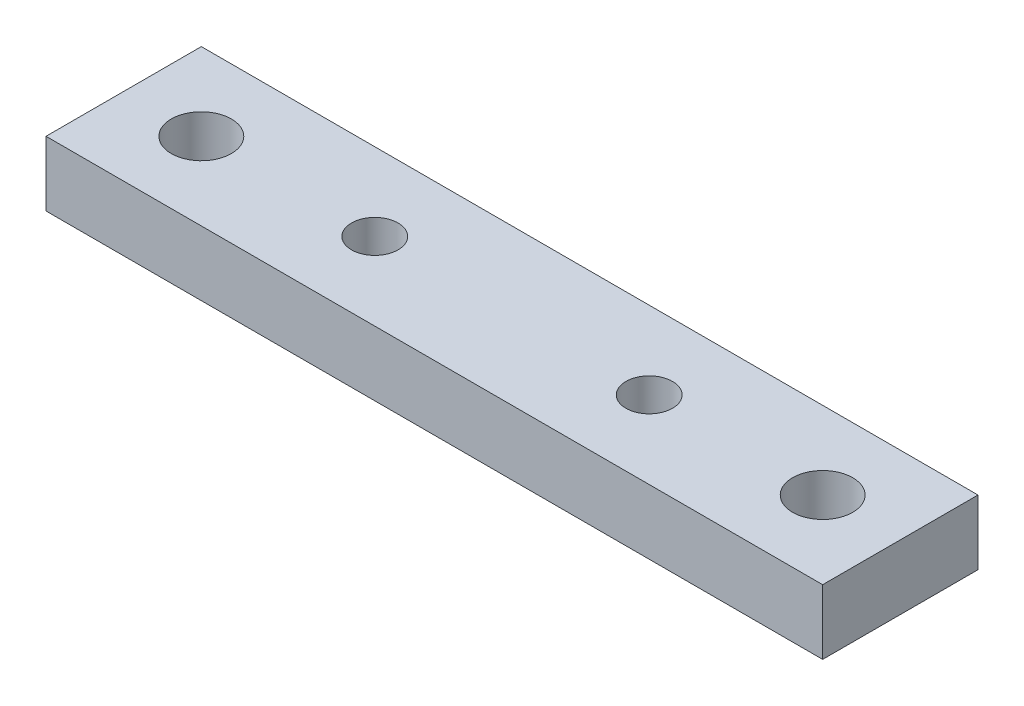
ISO-10303-21;
HEADER;
FILE_DESCRIPTION(('STEP AP214'),'2;1');
FILE_NAME('part.step','',(''),(''),'','','');
FILE_SCHEMA(('AUTOMOTIVE_DESIGN { 1 0 10303 214 1 1 1 1 }'));
ENDSEC;
DATA;
#1=APPLICATION_CONTEXT('core data for automotive mechanical design processes');
#2=APPLICATION_PROTOCOL_DEFINITION('international standard','automotive_design',2000,#1);
#3=PRODUCT_CONTEXT('',#1,'mechanical');
#4=PRODUCT('Part','Part','',(#3));
#5=PRODUCT_RELATED_PRODUCT_CATEGORY('part','',(#4));
#6=PRODUCT_DEFINITION_FORMATION('','',#4);
#7=PRODUCT_DEFINITION_CONTEXT('part definition',#1,'design');
#8=PRODUCT_DEFINITION('design','',#6,#7);
#9=PRODUCT_DEFINITION_SHAPE('','',#8);
#10=(LENGTH_UNIT() NAMED_UNIT(*) SI_UNIT(.MILLI.,.METRE.));
#11=(NAMED_UNIT(*) PLANE_ANGLE_UNIT() SI_UNIT($,.RADIAN.));
#12=(NAMED_UNIT(*) SI_UNIT($,.STERADIAN.) SOLID_ANGLE_UNIT());
#13=UNCERTAINTY_MEASURE_WITH_UNIT(LENGTH_MEASURE(1.E-05),#10,'distance_accuracy_value','');
#14=(GEOMETRIC_REPRESENTATION_CONTEXT(3) GLOBAL_UNCERTAINTY_ASSIGNED_CONTEXT((#13)) GLOBAL_UNIT_ASSIGNED_CONTEXT((#10,
#11,#12)) REPRESENTATION_CONTEXT('',''));
#15=CARTESIAN_POINT('',(0.,0.,0.));
#16=DIRECTION('',(0.,0.,1.));
#17=DIRECTION('',(1.,0.,0.));
#18=AXIS2_PLACEMENT_3D('',#15,#16,#17);
#19=CARTESIAN_POINT('',(19.05,3.175,3.81));
#20=DIRECTION('',(0.,1.,0.));
#21=DIRECTION('',(0.,0.,1.));
#22=AXIS2_PLACEMENT_3D('',#19,#20,#21);
#23=PLANE('',#22);
#24=CARTESIAN_POINT('',(15.24,3.175,0.));
#25=DIRECTION('',(0.,1.,0.));
#26=DIRECTION('',(0.,0.,-1.));
#27=AXIS2_PLACEMENT_3D('',#24,#25,#26);
#28=CIRCLE('',#27,1.4732);
#29=CARTESIAN_POINT('',(15.24,3.175,-1.4732));
#30=VERTEX_POINT('',#29);
#31=EDGE_CURVE('E150',#30,#30,#28,.T.);
#32=ORIENTED_EDGE('',*,*,#31,.F.);
#33=EDGE_LOOP('',(#32));
#34=FACE_BOUND('',#33,.T.);
#35=CARTESIAN_POINT('',(-15.24,3.175,0.));
#36=DIRECTION('',(0.,1.,0.));
#37=DIRECTION('',(0.,0.,1.));
#38=AXIS2_PLACEMENT_3D('',#35,#36,#37);
#39=CIRCLE('',#38,1.4732);
#40=CARTESIAN_POINT('',(-15.24,3.175,1.4732));
#41=VERTEX_POINT('',#40);
#42=EDGE_CURVE('E122',#41,#41,#39,.T.);
#43=ORIENTED_EDGE('',*,*,#42,.F.);
#44=EDGE_LOOP('',(#43));
#45=FACE_BOUND('',#44,.T.);
#46=DIRECTION('',(0.,0.,-1.));
#47=VECTOR('',#46,1.);
#48=CARTESIAN_POINT('',(19.05,3.175,-3.81));
#49=LINE('',#48,#47);
#50=CARTESIAN_POINT('',(19.05,3.175,3.81));
#51=VERTEX_POINT('',#50);
#52=CARTESIAN_POINT('',(19.05,3.175,-3.81));
#53=VERTEX_POINT('',#52);
#54=EDGE_CURVE('E100',#51,#53,#49,.T.);
#55=ORIENTED_EDGE('',*,*,#54,.T.);
#56=DIRECTION('',(-1.,0.,0.));
#57=VECTOR('',#56,1.);
#58=CARTESIAN_POINT('',(-19.05,3.175,-3.81));
#59=LINE('',#58,#57);
#60=CARTESIAN_POINT('',(-19.05,3.175,-3.81));
#61=VERTEX_POINT('',#60);
#62=EDGE_CURVE('E95',#53,#61,#59,.T.);
#63=ORIENTED_EDGE('',*,*,#62,.T.);
#64=DIRECTION('',(0.,0.,1.));
#65=VECTOR('',#64,1.);
#66=CARTESIAN_POINT('',(-19.05,3.175,-3.81));
#67=LINE('',#66,#65);
#68=CARTESIAN_POINT('',(-19.05,3.175,3.81));
#69=VERTEX_POINT('',#68);
#70=EDGE_CURVE('E98',#61,#69,#67,.T.);
#71=ORIENTED_EDGE('',*,*,#70,.T.);
#72=DIRECTION('',(1.,0.,0.));
#73=VECTOR('',#72,1.);
#74=CARTESIAN_POINT('',(-19.05,3.175,3.81));
#75=LINE('',#74,#73);
#76=EDGE_CURVE('E60',#69,#51,#75,.T.);
#77=ORIENTED_EDGE('',*,*,#76,.T.);
#78=EDGE_LOOP('',(#55,#63,#71,#77));
#79=FACE_BOUND('',#78,.T.);
#80=CARTESIAN_POINT('',(-6.731,3.175,0.));
#81=DIRECTION('',(0.,1.,0.));
#82=DIRECTION('',(0.,0.,1.));
#83=AXIS2_PLACEMENT_3D('',#80,#81,#82);
#84=CIRCLE('',#83,1.143);
#85=CARTESIAN_POINT('',(-6.731,3.175,1.143));
#86=VERTEX_POINT('',#85);
#87=EDGE_CURVE('E142',#86,#86,#84,.T.);
#88=ORIENTED_EDGE('',*,*,#87,.F.);
#89=EDGE_LOOP('',(#88));
#90=FACE_BOUND('',#89,.T.);
#91=CARTESIAN_POINT('',(6.731,3.175,0.));
#92=DIRECTION('',(0.,1.,0.));
#93=DIRECTION('',(0.,0.,-1.));
#94=AXIS2_PLACEMENT_3D('',#91,#92,#93);
#95=CIRCLE('',#94,1.143);
#96=CARTESIAN_POINT('',(6.731,3.175,-1.143));
#97=VERTEX_POINT('',#96);
#98=EDGE_CURVE('E158',#97,#97,#95,.T.);
#99=ORIENTED_EDGE('',*,*,#98,.F.);
#100=EDGE_LOOP('',(#99));
#101=FACE_BOUND('',#100,.T.);
#102=ADVANCED_FACE('F39',(#34,#45,#79,#90,#101),#23,.T.);
#103=CARTESIAN_POINT('',(19.05,0.,3.81));
#104=DIRECTION('',(0.,1.,0.));
#105=DIRECTION('',(0.,0.,1.));
#106=AXIS2_PLACEMENT_3D('',#103,#104,#105);
#107=PLANE('',#106);
#108=CARTESIAN_POINT('',(15.24,0.,0.));
#109=DIRECTION('',(0.,1.,0.));
#110=DIRECTION('',(0.,0.,-1.));
#111=AXIS2_PLACEMENT_3D('',#108,#109,#110);
#112=CIRCLE('',#111,1.4732);
#113=CARTESIAN_POINT('',(15.24,0.,-1.4732));
#114=VERTEX_POINT('',#113);
#115=EDGE_CURVE('E154',#114,#114,#112,.T.);
#116=ORIENTED_EDGE('',*,*,#115,.T.);
#117=EDGE_LOOP('',(#116));
#118=FACE_BOUND('',#117,.T.);
#119=CARTESIAN_POINT('',(-15.24,0.,0.));
#120=DIRECTION('',(0.,1.,0.));
#121=DIRECTION('',(0.,0.,1.));
#122=AXIS2_PLACEMENT_3D('',#119,#120,#121);
#123=CIRCLE('',#122,1.4732);
#124=CARTESIAN_POINT('',(-15.24,0.,1.4732));
#125=VERTEX_POINT('',#124);
#126=EDGE_CURVE('E139',#125,#125,#123,.T.);
#127=ORIENTED_EDGE('',*,*,#126,.T.);
#128=EDGE_LOOP('',(#127));
#129=FACE_BOUND('',#128,.T.);
#130=DIRECTION('',(0.,0.,-1.));
#131=VECTOR('',#130,1.);
#132=CARTESIAN_POINT('',(19.05,0.,-3.81));
#133=LINE('',#132,#131);
#134=CARTESIAN_POINT('',(19.05,0.,3.81));
#135=VERTEX_POINT('',#134);
#136=CARTESIAN_POINT('',(19.05,0.,-3.81));
#137=VERTEX_POINT('',#136);
#138=EDGE_CURVE('E118',#135,#137,#133,.T.);
#139=ORIENTED_EDGE('',*,*,#138,.F.);
#140=DIRECTION('',(1.,0.,0.));
#141=VECTOR('',#140,1.);
#142=CARTESIAN_POINT('',(-19.05,0.,3.81));
#143=LINE('',#142,#141);
#144=CARTESIAN_POINT('',(-19.05,0.,3.81));
#145=VERTEX_POINT('',#144);
#146=EDGE_CURVE('E87',#145,#135,#143,.T.);
#147=ORIENTED_EDGE('',*,*,#146,.F.);
#148=DIRECTION('',(0.,0.,1.));
#149=VECTOR('',#148,1.);
#150=CARTESIAN_POINT('',(-19.05,0.,-3.81));
#151=LINE('',#150,#149);
#152=CARTESIAN_POINT('',(-19.05,0.,-3.81));
#153=VERTEX_POINT('',#152);
#154=EDGE_CURVE('E81',#153,#145,#151,.T.);
#155=ORIENTED_EDGE('',*,*,#154,.F.);
#156=DIRECTION('',(-1.,0.,0.));
#157=VECTOR('',#156,1.);
#158=CARTESIAN_POINT('',(-19.05,0.,-3.81));
#159=LINE('',#158,#157);
#160=EDGE_CURVE('E105',#137,#153,#159,.T.);
#161=ORIENTED_EDGE('',*,*,#160,.F.);
#162=EDGE_LOOP('',(#139,#147,#155,#161));
#163=FACE_BOUND('',#162,.T.);
#164=CARTESIAN_POINT('',(-6.731,0.,0.));
#165=DIRECTION('',(0.,1.,0.));
#166=DIRECTION('',(0.,0.,1.));
#167=AXIS2_PLACEMENT_3D('',#164,#165,#166);
#168=CIRCLE('',#167,1.143);
#169=CARTESIAN_POINT('',(-6.731,0.,1.143));
#170=VERTEX_POINT('',#169);
#171=EDGE_CURVE('E146',#170,#170,#168,.T.);
#172=ORIENTED_EDGE('',*,*,#171,.T.);
#173=EDGE_LOOP('',(#172));
#174=FACE_BOUND('',#173,.T.);
#175=CARTESIAN_POINT('',(6.731,0.,0.));
#176=DIRECTION('',(0.,1.,0.));
#177=DIRECTION('',(0.,0.,-1.));
#178=AXIS2_PLACEMENT_3D('',#175,#176,#177);
#179=CIRCLE('',#178,1.143);
#180=CARTESIAN_POINT('',(6.731,0.,-1.143));
#181=VERTEX_POINT('',#180);
#182=EDGE_CURVE('E162',#181,#181,#179,.T.);
#183=ORIENTED_EDGE('',*,*,#182,.T.);
#184=EDGE_LOOP('',(#183));
#185=FACE_BOUND('',#184,.T.);
#186=ADVANCED_FACE('F134',(#118,#129,#163,#174,#185),#107,.F.);
#187=CARTESIAN_POINT('',(19.05,3.175,-3.81));
#188=DIRECTION('',(-1.,0.,0.));
#189=DIRECTION('',(0.,0.,1.));
#190=AXIS2_PLACEMENT_3D('',#187,#188,#189);
#191=PLANE('',#190);
#192=ORIENTED_EDGE('',*,*,#138,.T.);
#193=DIRECTION('',(0.,-1.,0.));
#194=VECTOR('',#193,1.);
#195=CARTESIAN_POINT('',(19.05,3.175,-3.81));
#196=LINE('',#195,#194);
#197=EDGE_CURVE('E11',#53,#137,#196,.T.);
#198=ORIENTED_EDGE('',*,*,#197,.F.);
#199=ORIENTED_EDGE('',*,*,#54,.F.);
#200=DIRECTION('',(0.,-1.,0.));
#201=VECTOR('',#200,1.);
#202=CARTESIAN_POINT('',(19.05,3.175,3.81));
#203=LINE('',#202,#201);
#204=EDGE_CURVE('E114',#51,#135,#203,.T.);
#205=ORIENTED_EDGE('',*,*,#204,.T.);
#206=EDGE_LOOP('',(#192,#198,#199,#205));
#207=FACE_BOUND('',#206,.T.);
#208=ADVANCED_FACE('F41',(#207),#191,.F.);
#209=CARTESIAN_POINT('',(-19.05,3.175,-3.81));
#210=DIRECTION('',(0.,0.,1.));
#211=DIRECTION('',(1.,0.,0.));
#212=AXIS2_PLACEMENT_3D('',#209,#210,#211);
#213=PLANE('',#212);
#214=ORIENTED_EDGE('',*,*,#160,.T.);
#215=DIRECTION('',(0.,-1.,0.));
#216=VECTOR('',#215,1.);
#217=CARTESIAN_POINT('',(-19.05,3.175,-3.81));
#218=LINE('',#217,#216);
#219=EDGE_CURVE('E49',#61,#153,#218,.T.);
#220=ORIENTED_EDGE('',*,*,#219,.F.);
#221=ORIENTED_EDGE('',*,*,#62,.F.);
#222=ORIENTED_EDGE('',*,*,#197,.T.);
#223=EDGE_LOOP('',(#214,#220,#221,#222));
#224=FACE_BOUND('',#223,.T.);
#225=ADVANCED_FACE('F104',(#224),#213,.F.);
#226=CARTESIAN_POINT('',(-19.05,3.175,-3.81));
#227=DIRECTION('',(1.,0.,0.));
#228=DIRECTION('',(0.,0.,-1.));
#229=AXIS2_PLACEMENT_3D('',#226,#227,#228);
#230=PLANE('',#229);
#231=ORIENTED_EDGE('',*,*,#154,.T.);
#232=DIRECTION('',(0.,-1.,0.));
#233=VECTOR('',#232,1.);
#234=CARTESIAN_POINT('',(-19.05,3.175,3.81));
#235=LINE('',#234,#233);
#236=EDGE_CURVE('E107',#69,#145,#235,.T.);
#237=ORIENTED_EDGE('',*,*,#236,.F.);
#238=ORIENTED_EDGE('',*,*,#70,.F.);
#239=ORIENTED_EDGE('',*,*,#219,.T.);
#240=EDGE_LOOP('',(#231,#237,#238,#239));
#241=FACE_BOUND('',#240,.T.);
#242=ADVANCED_FACE('F108',(#241),#230,.F.);
#243=CARTESIAN_POINT('',(-19.05,3.175,3.81));
#244=DIRECTION('',(0.,0.,-1.));
#245=DIRECTION('',(-1.,0.,0.));
#246=AXIS2_PLACEMENT_3D('',#243,#244,#245);
#247=PLANE('',#246);
#248=ORIENTED_EDGE('',*,*,#146,.T.);
#249=ORIENTED_EDGE('',*,*,#204,.F.);
#250=ORIENTED_EDGE('',*,*,#76,.F.);
#251=ORIENTED_EDGE('',*,*,#236,.T.);
#252=EDGE_LOOP('',(#248,#249,#250,#251));
#253=FACE_BOUND('',#252,.T.);
#254=ADVANCED_FACE('F131',(#253),#247,.F.);
#255=CARTESIAN_POINT('',(-15.24,3.175,0.));
#256=DIRECTION('',(0.,-1.,0.));
#257=DIRECTION('',(0.,0.,-1.));
#258=AXIS2_PLACEMENT_3D('',#255,#256,#257);
#259=CYLINDRICAL_SURFACE('',#258,1.4732);
#260=ORIENTED_EDGE('',*,*,#42,.T.);
#261=EDGE_LOOP('',(#260));
#262=FACE_BOUND('',#261,.T.);
#263=ORIENTED_EDGE('',*,*,#126,.F.);
#264=EDGE_LOOP('',(#263));
#265=FACE_BOUND('',#264,.T.);
#266=ADVANCED_FACE('F184',(#262,#265),#259,.F.);
#267=CARTESIAN_POINT('',(-6.731,3.175,0.));
#268=DIRECTION('',(0.,-1.,0.));
#269=DIRECTION('',(0.,0.,-1.));
#270=AXIS2_PLACEMENT_3D('',#267,#268,#269);
#271=CYLINDRICAL_SURFACE('',#270,1.143);
#272=ORIENTED_EDGE('',*,*,#87,.T.);
#273=EDGE_LOOP('',(#272));
#274=FACE_BOUND('',#273,.T.);
#275=ORIENTED_EDGE('',*,*,#171,.F.);
#276=EDGE_LOOP('',(#275));
#277=FACE_BOUND('',#276,.T.);
#278=ADVANCED_FACE('F214',(#274,#277),#271,.F.);
#279=CARTESIAN_POINT('',(15.24,3.175,0.));
#280=DIRECTION('',(0.,-1.,0.));
#281=DIRECTION('',(0.,0.,-1.));
#282=AXIS2_PLACEMENT_3D('',#279,#280,#281);
#283=CYLINDRICAL_SURFACE('',#282,1.4732);
#284=ORIENTED_EDGE('',*,*,#31,.T.);
#285=EDGE_LOOP('',(#284));
#286=FACE_BOUND('',#285,.T.);
#287=ORIENTED_EDGE('',*,*,#115,.F.);
#288=EDGE_LOOP('',(#287));
#289=FACE_BOUND('',#288,.T.);
#290=ADVANCED_FACE('F217',(#286,#289),#283,.F.);
#291=CARTESIAN_POINT('',(6.731,3.175,0.));
#292=DIRECTION('',(0.,-1.,0.));
#293=DIRECTION('',(0.,0.,-1.));
#294=AXIS2_PLACEMENT_3D('',#291,#292,#293);
#295=CYLINDRICAL_SURFACE('',#294,1.143);
#296=ORIENTED_EDGE('',*,*,#98,.T.);
#297=EDGE_LOOP('',(#296));
#298=FACE_BOUND('',#297,.T.);
#299=ORIENTED_EDGE('',*,*,#182,.F.);
#300=EDGE_LOOP('',(#299));
#301=FACE_BOUND('',#300,.T.);
#302=ADVANCED_FACE('F170',(#298,#301),#295,.F.);
#303=CLOSED_SHELL('',(#102,#186,#208,#225,#242,#254,#266,#278,#290,#302));
#304=MANIFOLD_SOLID_BREP('B2',#303);
#305=ADVANCED_BREP_SHAPE_REPRESENTATION('',(#18,#304),#14);
#306=SHAPE_DEFINITION_REPRESENTATION(#9,#305);
ENDSEC;
END-ISO-10303-21;
